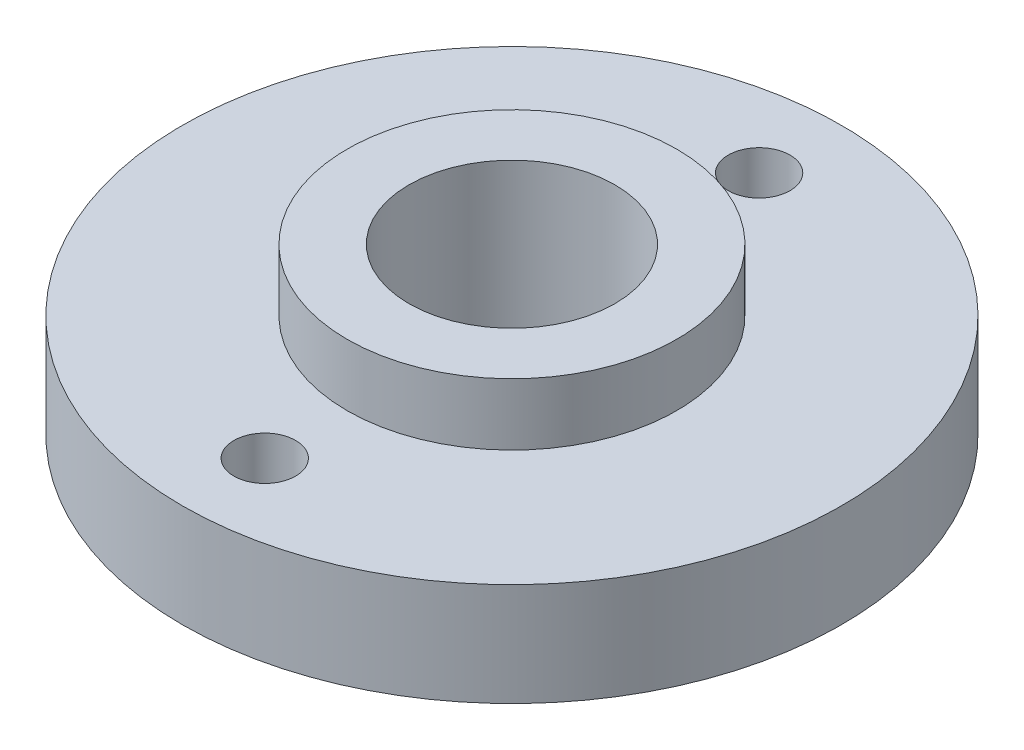
ISO-10303-21;
HEADER;
FILE_DESCRIPTION(('STEP AP214'),'2;1');
FILE_NAME('part.step','',(''),(''),'','','');
FILE_SCHEMA(('AUTOMOTIVE_DESIGN { 1 0 10303 214 1 1 1 1 }'));
ENDSEC;
DATA;
#1=APPLICATION_CONTEXT('core data for automotive mechanical design processes');
#2=APPLICATION_PROTOCOL_DEFINITION('international standard','automotive_design',2000,#1);
#3=PRODUCT_CONTEXT('',#1,'mechanical');
#4=PRODUCT('Part','Part','',(#3));
#5=PRODUCT_RELATED_PRODUCT_CATEGORY('part','',(#4));
#6=PRODUCT_DEFINITION_FORMATION('','',#4);
#7=PRODUCT_DEFINITION_CONTEXT('part definition',#1,'design');
#8=PRODUCT_DEFINITION('design','',#6,#7);
#9=PRODUCT_DEFINITION_SHAPE('','',#8);
#10=(LENGTH_UNIT() NAMED_UNIT(*) SI_UNIT(.MILLI.,.METRE.));
#11=(NAMED_UNIT(*) PLANE_ANGLE_UNIT() SI_UNIT($,.RADIAN.));
#12=(NAMED_UNIT(*) SI_UNIT($,.STERADIAN.) SOLID_ANGLE_UNIT());
#13=UNCERTAINTY_MEASURE_WITH_UNIT(LENGTH_MEASURE(1.E-05),#10,'distance_accuracy_value','');
#14=(GEOMETRIC_REPRESENTATION_CONTEXT(3) GLOBAL_UNCERTAINTY_ASSIGNED_CONTEXT((#13)) GLOBAL_UNIT_ASSIGNED_CONTEXT((#10,
#11,#12)) REPRESENTATION_CONTEXT('',''));
#15=CARTESIAN_POINT('',(0.,0.,0.));
#16=DIRECTION('',(0.,0.,1.));
#17=DIRECTION('',(1.,0.,0.));
#18=AXIS2_PLACEMENT_3D('',#15,#16,#17);
#19=CARTESIAN_POINT('',(0.,18.0956474441252,0.));
#20=DIRECTION('',(0.,1.,0.));
#21=DIRECTION('',(0.,0.,1.));
#22=AXIS2_PLACEMENT_3D('',#19,#20,#21);
#23=CYLINDRICAL_SURFACE('',#22,5.);
#24=CARTESIAN_POINT('',(0.,0.,0.));
#25=DIRECTION('',(0.,1.,0.));
#26=DIRECTION('',(0.,0.,1.));
#27=AXIS2_PLACEMENT_3D('',#24,#25,#26);
#28=CIRCLE('',#27,5.);
#29=CARTESIAN_POINT('',(0.,0.,5.));
#30=VERTEX_POINT('',#29);
#31=EDGE_CURVE('E10',#30,#30,#28,.T.);
#32=ORIENTED_EDGE('',*,*,#31,.F.);
#33=EDGE_LOOP('',(#32));
#34=FACE_BOUND('',#33,.T.);
#35=CARTESIAN_POINT('',(0.,8.,0.));
#36=DIRECTION('',(0.,1.,0.));
#37=DIRECTION('',(0.,0.,1.));
#38=AXIS2_PLACEMENT_3D('',#35,#36,#37);
#39=CIRCLE('',#38,5.);
#40=CARTESIAN_POINT('',(0.,8.,5.));
#41=VERTEX_POINT('',#40);
#42=EDGE_CURVE('E55',#41,#41,#39,.T.);
#43=ORIENTED_EDGE('',*,*,#42,.T.);
#44=EDGE_LOOP('',(#43));
#45=FACE_BOUND('',#44,.T.);
#46=ADVANCED_FACE('F33',(#34,#45),#23,.F.);
#47=CARTESIAN_POINT('',(0.,0.,-5.));
#48=DIRECTION('',(0.,1.,0.));
#49=DIRECTION('',(0.,0.,1.));
#50=AXIS2_PLACEMENT_3D('',#47,#48,#49);
#51=PLANE('',#50);
#52=CARTESIAN_POINT('',(0.,0.,12.));
#53=DIRECTION('',(0.,1.,0.));
#54=DIRECTION('',(0.,0.,1.));
#55=AXIS2_PLACEMENT_3D('',#52,#53,#54);
#56=CIRCLE('',#55,1.5);
#57=CARTESIAN_POINT('',(0.,0.,13.5));
#58=VERTEX_POINT('',#57);
#59=EDGE_CURVE('E62',#58,#58,#56,.T.);
#60=ORIENTED_EDGE('',*,*,#59,.T.);
#61=EDGE_LOOP('',(#60));
#62=FACE_BOUND('',#61,.T.);
#63=CARTESIAN_POINT('',(0.,0.,-12.));
#64=DIRECTION('',(0.,1.,0.));
#65=DIRECTION('',(0.,0.,1.));
#66=AXIS2_PLACEMENT_3D('',#63,#64,#65);
#67=CIRCLE('',#66,1.5);
#68=CARTESIAN_POINT('',(0.,0.,-10.5));
#69=VERTEX_POINT('',#68);
#70=EDGE_CURVE('E58',#69,#69,#67,.T.);
#71=ORIENTED_EDGE('',*,*,#70,.T.);
#72=EDGE_LOOP('',(#71));
#73=FACE_BOUND('',#72,.T.);
#74=CARTESIAN_POINT('',(0.,0.,0.));
#75=DIRECTION('',(0.,1.,0.));
#76=DIRECTION('',(0.,0.,1.));
#77=AXIS2_PLACEMENT_3D('',#74,#75,#76);
#78=CIRCLE('',#77,16.);
#79=CARTESIAN_POINT('',(0.,0.,16.));
#80=VERTEX_POINT('',#79);
#81=EDGE_CURVE('E39',#80,#80,#78,.T.);
#82=ORIENTED_EDGE('',*,*,#81,.F.);
#83=EDGE_LOOP('',(#82));
#84=FACE_BOUND('',#83,.T.);
#85=ORIENTED_EDGE('',*,*,#31,.T.);
#86=EDGE_LOOP('',(#85));
#87=FACE_BOUND('',#86,.T.);
#88=ADVANCED_FACE('F71',(#62,#73,#84,#87),#51,.F.);
#89=CARTESIAN_POINT('',(0.,18.0956474441252,0.));
#90=DIRECTION('',(0.,1.,0.));
#91=DIRECTION('',(0.,0.,1.));
#92=AXIS2_PLACEMENT_3D('',#89,#90,#91);
#93=CYLINDRICAL_SURFACE('',#92,16.);
#94=CARTESIAN_POINT('',(0.,5.,0.));
#95=DIRECTION('',(0.,1.,0.));
#96=DIRECTION('',(0.,0.,1.));
#97=AXIS2_PLACEMENT_3D('',#94,#95,#96);
#98=CIRCLE('',#97,16.);
#99=CARTESIAN_POINT('',(0.,5.,16.));
#100=VERTEX_POINT('',#99);
#101=EDGE_CURVE('E43',#100,#100,#98,.T.);
#102=ORIENTED_EDGE('',*,*,#101,.F.);
#103=EDGE_LOOP('',(#102));
#104=FACE_BOUND('',#103,.T.);
#105=ORIENTED_EDGE('',*,*,#81,.T.);
#106=EDGE_LOOP('',(#105));
#107=FACE_BOUND('',#106,.T.);
#108=ADVANCED_FACE('F85',(#104,#107),#93,.T.);
#109=CARTESIAN_POINT('',(0.,5.,-16.));
#110=DIRECTION('',(0.,-1.,0.));
#111=DIRECTION('',(0.,0.,-1.));
#112=AXIS2_PLACEMENT_3D('',#109,#110,#111);
#113=PLANE('',#112);
#114=CARTESIAN_POINT('',(0.,5.,12.));
#115=DIRECTION('',(0.,1.,0.));
#116=DIRECTION('',(0.,0.,1.));
#117=AXIS2_PLACEMENT_3D('',#114,#115,#116);
#118=CIRCLE('',#117,1.5);
#119=CARTESIAN_POINT('',(0.,5.,13.5));
#120=VERTEX_POINT('',#119);
#121=EDGE_CURVE('E65',#120,#120,#118,.T.);
#122=ORIENTED_EDGE('',*,*,#121,.F.);
#123=EDGE_LOOP('',(#122));
#124=FACE_BOUND('',#123,.T.);
#125=CARTESIAN_POINT('',(0.,5.,-12.));
#126=DIRECTION('',(0.,1.,0.));
#127=DIRECTION('',(0.,0.,1.));
#128=AXIS2_PLACEMENT_3D('',#125,#126,#127);
#129=CIRCLE('',#128,1.5);
#130=CARTESIAN_POINT('',(0.,5.,-10.5));
#131=VERTEX_POINT('',#130);
#132=EDGE_CURVE('E59',#131,#131,#129,.T.);
#133=ORIENTED_EDGE('',*,*,#132,.F.);
#134=EDGE_LOOP('',(#133));
#135=FACE_BOUND('',#134,.T.);
#136=CARTESIAN_POINT('',(0.,5.,0.));
#137=DIRECTION('',(0.,1.,0.));
#138=DIRECTION('',(0.,0.,1.));
#139=AXIS2_PLACEMENT_3D('',#136,#137,#138);
#140=CIRCLE('',#139,8.);
#141=CARTESIAN_POINT('',(0.,5.,8.));
#142=VERTEX_POINT('',#141);
#143=EDGE_CURVE('E47',#142,#142,#140,.T.);
#144=ORIENTED_EDGE('',*,*,#143,.F.);
#145=EDGE_LOOP('',(#144));
#146=FACE_BOUND('',#145,.T.);
#147=ORIENTED_EDGE('',*,*,#101,.T.);
#148=EDGE_LOOP('',(#147));
#149=FACE_BOUND('',#148,.T.);
#150=ADVANCED_FACE('F81',(#124,#135,#146,#149),#113,.F.);
#151=CARTESIAN_POINT('',(0.,18.0956474441252,0.));
#152=DIRECTION('',(0.,1.,0.));
#153=DIRECTION('',(0.,0.,1.));
#154=AXIS2_PLACEMENT_3D('',#151,#152,#153);
#155=CYLINDRICAL_SURFACE('',#154,8.);
#156=CARTESIAN_POINT('',(0.,8.,0.));
#157=DIRECTION('',(0.,1.,0.));
#158=DIRECTION('',(0.,0.,1.));
#159=AXIS2_PLACEMENT_3D('',#156,#157,#158);
#160=CIRCLE('',#159,8.);
#161=CARTESIAN_POINT('',(0.,8.,8.));
#162=VERTEX_POINT('',#161);
#163=EDGE_CURVE('E52',#162,#162,#160,.T.);
#164=ORIENTED_EDGE('',*,*,#163,.F.);
#165=EDGE_LOOP('',(#164));
#166=FACE_BOUND('',#165,.T.);
#167=ORIENTED_EDGE('',*,*,#143,.T.);
#168=EDGE_LOOP('',(#167));
#169=FACE_BOUND('',#168,.T.);
#170=ADVANCED_FACE('F84',(#166,#169),#155,.T.);
#171=CARTESIAN_POINT('',(0.,8.,-8.));
#172=DIRECTION('',(0.,-1.,0.));
#173=DIRECTION('',(0.,0.,-1.));
#174=AXIS2_PLACEMENT_3D('',#171,#172,#173);
#175=PLANE('',#174);
#176=ORIENTED_EDGE('',*,*,#42,.F.);
#177=EDGE_LOOP('',(#176));
#178=FACE_BOUND('',#177,.T.);
#179=ORIENTED_EDGE('',*,*,#163,.T.);
#180=EDGE_LOOP('',(#179));
#181=FACE_BOUND('',#180,.T.);
#182=ADVANCED_FACE('F105',(#178,#181),#175,.F.);
#183=CARTESIAN_POINT('',(0.,0.,-12.));
#184=DIRECTION('',(0.,1.,0.));
#185=DIRECTION('',(0.,0.,1.));
#186=AXIS2_PLACEMENT_3D('',#183,#184,#185);
#187=CYLINDRICAL_SURFACE('',#186,1.5);
#188=ORIENTED_EDGE('',*,*,#70,.F.);
#189=EDGE_LOOP('',(#188));
#190=FACE_BOUND('',#189,.T.);
#191=ORIENTED_EDGE('',*,*,#132,.T.);
#192=EDGE_LOOP('',(#191));
#193=FACE_BOUND('',#192,.T.);
#194=ADVANCED_FACE('F77',(#190,#193),#187,.F.);
#195=CARTESIAN_POINT('',(0.,0.,12.));
#196=DIRECTION('',(0.,1.,0.));
#197=DIRECTION('',(0.,0.,1.));
#198=AXIS2_PLACEMENT_3D('',#195,#196,#197);
#199=CYLINDRICAL_SURFACE('',#198,1.5);
#200=ORIENTED_EDGE('',*,*,#59,.F.);
#201=EDGE_LOOP('',(#200));
#202=FACE_BOUND('',#201,.T.);
#203=ORIENTED_EDGE('',*,*,#121,.T.);
#204=EDGE_LOOP('',(#203));
#205=FACE_BOUND('',#204,.T.);
#206=ADVANCED_FACE('F74',(#202,#205),#199,.F.);
#207=CLOSED_SHELL('',(#46,#88,#108,#150,#170,#182,#194,#206));
#208=MANIFOLD_SOLID_BREP('B2',#207);
#209=ADVANCED_BREP_SHAPE_REPRESENTATION('',(#18,#208),#14);
#210=SHAPE_DEFINITION_REPRESENTATION(#9,#209);
ENDSEC;
END-ISO-10303-21;
